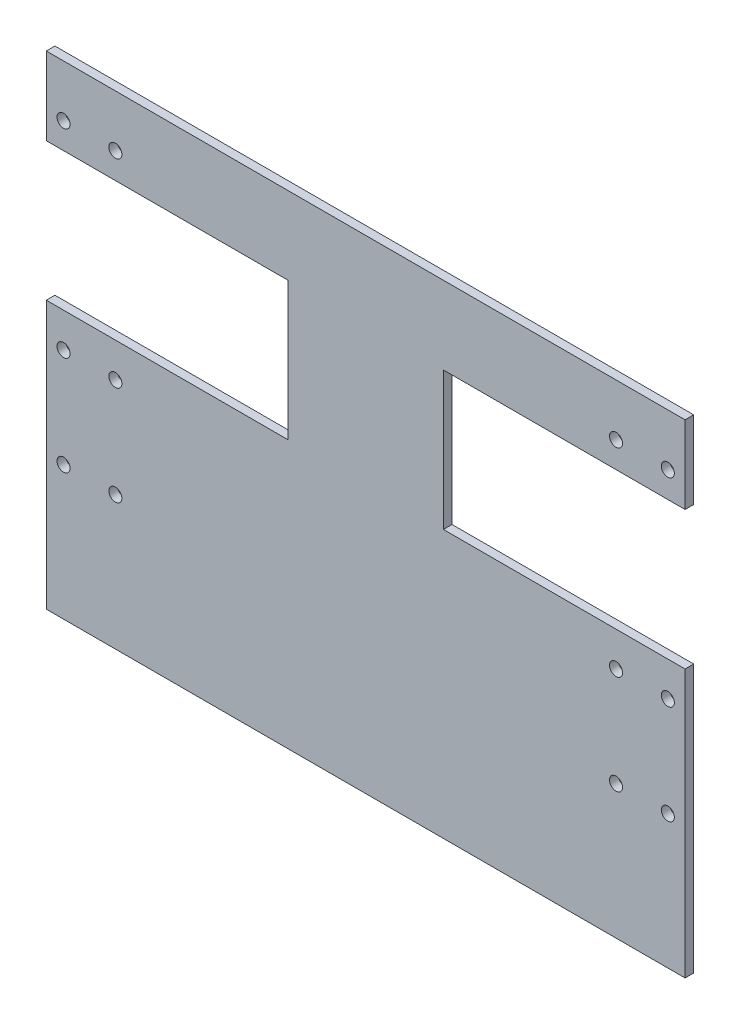
ISO-10303-21;
HEADER;
FILE_DESCRIPTION(('STEP AP214'),'2;1');
FILE_NAME('part.step','',(''),(''),'','','');
FILE_SCHEMA(('AUTOMOTIVE_DESIGN { 1 0 10303 214 1 1 1 1 }'));
ENDSEC;
DATA;
#1=APPLICATION_CONTEXT('core data for automotive mechanical design processes');
#2=APPLICATION_PROTOCOL_DEFINITION('international standard','automotive_design',2000,#1);
#3=PRODUCT_CONTEXT('',#1,'mechanical');
#4=PRODUCT('Part','Part','',(#3));
#5=PRODUCT_RELATED_PRODUCT_CATEGORY('part','',(#4));
#6=PRODUCT_DEFINITION_FORMATION('','',#4);
#7=PRODUCT_DEFINITION_CONTEXT('part definition',#1,'design');
#8=PRODUCT_DEFINITION('design','',#6,#7);
#9=PRODUCT_DEFINITION_SHAPE('','',#8);
#10=(LENGTH_UNIT() NAMED_UNIT(*) SI_UNIT(.MILLI.,.METRE.));
#11=(NAMED_UNIT(*) PLANE_ANGLE_UNIT() SI_UNIT($,.RADIAN.));
#12=(NAMED_UNIT(*) SI_UNIT($,.STERADIAN.) SOLID_ANGLE_UNIT());
#13=UNCERTAINTY_MEASURE_WITH_UNIT(LENGTH_MEASURE(1.E-05),#10,'distance_accuracy_value','');
#14=(GEOMETRIC_REPRESENTATION_CONTEXT(3) GLOBAL_UNCERTAINTY_ASSIGNED_CONTEXT((#13)) GLOBAL_UNIT_ASSIGNED_CONTEXT((#10,
#11,#12)) REPRESENTATION_CONTEXT('',''));
#15=CARTESIAN_POINT('',(0.,0.,0.));
#16=DIRECTION('',(0.,0.,1.));
#17=DIRECTION('',(1.,0.,0.));
#18=AXIS2_PLACEMENT_3D('',#15,#16,#17);
#19=CARTESIAN_POINT('',(0.,0.,0.));
#20=DIRECTION('',(0.,0.,-1.));
#21=DIRECTION('',(-1.,0.,0.));
#22=AXIS2_PLACEMENT_3D('',#19,#20,#21);
#23=PLANE('',#22);
#24=CARTESIAN_POINT('',(25.4,158.75,0.));
#25=DIRECTION('',(0.,0.,-1.));
#26=DIRECTION('',(-1.,0.,0.));
#27=AXIS2_PLACEMENT_3D('',#24,#25,#26);
#28=CIRCLE('',#27,2.4003);
#29=CARTESIAN_POINT('',(22.9997,158.75,0.));
#30=VERTEX_POINT('',#29);
#31=EDGE_CURVE('E161',#30,#30,#28,.F.);
#32=ORIENTED_EDGE('',*,*,#31,.T.);
#33=EDGE_LOOP('',(#32));
#34=FACE_BOUND('',#33,.T.);
#35=CARTESIAN_POINT('',(25.4,85.725,0.));
#36=DIRECTION('',(0.,0.,-1.));
#37=DIRECTION('',(-1.,0.,0.));
#38=AXIS2_PLACEMENT_3D('',#35,#36,#37);
#39=CIRCLE('',#38,2.40029999999999);
#40=CARTESIAN_POINT('',(22.9997,85.725,0.));
#41=VERTEX_POINT('',#40);
#42=EDGE_CURVE('E167',#41,#41,#39,.F.);
#43=ORIENTED_EDGE('',*,*,#42,.T.);
#44=EDGE_LOOP('',(#43));
#45=FACE_BOUND('',#44,.T.);
#46=CARTESIAN_POINT('',(25.4,49.2124999999995,0.));
#47=DIRECTION('',(0.,0.,-1.));
#48=DIRECTION('',(-1.,0.,0.));
#49=AXIS2_PLACEMENT_3D('',#46,#47,#48);
#50=CIRCLE('',#49,2.40029999999999);
#51=CARTESIAN_POINT('',(22.9997,49.2124999999995,0.));
#52=VERTEX_POINT('',#51);
#53=EDGE_CURVE('E173',#52,#52,#50,.F.);
#54=ORIENTED_EDGE('',*,*,#53,.T.);
#55=EDGE_LOOP('',(#54));
#56=FACE_BOUND('',#55,.T.);
#57=CARTESIAN_POINT('',(228.6,49.2124999999995,0.));
#58=DIRECTION('',(0.,0.,-1.));
#59=DIRECTION('',(-1.,0.,0.));
#60=AXIS2_PLACEMENT_3D('',#57,#58,#59);
#61=CIRCLE('',#60,2.40029999999999);
#62=CARTESIAN_POINT('',(226.1997,49.2124999999995,0.));
#63=VERTEX_POINT('',#62);
#64=EDGE_CURVE('E179',#63,#63,#61,.F.);
#65=ORIENTED_EDGE('',*,*,#64,.T.);
#66=EDGE_LOOP('',(#65));
#67=FACE_BOUND('',#66,.T.);
#68=CARTESIAN_POINT('',(228.6,85.725,0.));
#69=DIRECTION('',(0.,0.,-1.));
#70=DIRECTION('',(-1.,0.,0.));
#71=AXIS2_PLACEMENT_3D('',#68,#69,#70);
#72=CIRCLE('',#71,2.40029999999999);
#73=CARTESIAN_POINT('',(226.1997,85.725,0.));
#74=VERTEX_POINT('',#73);
#75=EDGE_CURVE('E185',#74,#74,#72,.F.);
#76=ORIENTED_EDGE('',*,*,#75,.T.);
#77=EDGE_LOOP('',(#76));
#78=FACE_BOUND('',#77,.T.);
#79=CARTESIAN_POINT('',(228.6,158.75,0.));
#80=DIRECTION('',(0.,0.,-1.));
#81=DIRECTION('',(-1.,0.,0.));
#82=AXIS2_PLACEMENT_3D('',#79,#80,#81);
#83=CIRCLE('',#82,2.40029999999999);
#84=CARTESIAN_POINT('',(226.1997,158.75,0.));
#85=VERTEX_POINT('',#84);
#86=EDGE_CURVE('E190',#85,#85,#83,.F.);
#87=ORIENTED_EDGE('',*,*,#86,.T.);
#88=EDGE_LOOP('',(#87));
#89=FACE_BOUND('',#88,.T.);
#90=DIRECTION('',(0.,1.,0.));
#91=VECTOR('',#90,1.);
#92=CARTESIAN_POINT('',(0.,149.225,0.));
#93=LINE('',#92,#91);
#94=CARTESIAN_POINT('',(0.,149.225,0.));
#95=VERTEX_POINT('',#94);
#96=CARTESIAN_POINT('',(0.,177.8,0.));
#97=VERTEX_POINT('',#96);
#98=EDGE_CURVE('E208',#95,#97,#93,.T.);
#99=ORIENTED_EDGE('',*,*,#98,.T.);
#100=DIRECTION('',(1.,0.,0.));
#101=VECTOR('',#100,1.);
#102=CARTESIAN_POINT('',(0.,177.8,0.));
#103=LINE('',#102,#101);
#104=CARTESIAN_POINT('',(234.95,177.8,0.));
#105=VERTEX_POINT('',#104);
#106=EDGE_CURVE('E203',#97,#105,#103,.T.);
#107=ORIENTED_EDGE('',*,*,#106,.T.);
#108=DIRECTION('',(0.,-1.,0.));
#109=VECTOR('',#108,1.);
#110=CARTESIAN_POINT('',(234.95,149.225,0.));
#111=LINE('',#110,#109);
#112=CARTESIAN_POINT('',(234.95,149.225,0.));
#113=VERTEX_POINT('',#112);
#114=EDGE_CURVE('E108',#105,#113,#111,.T.);
#115=ORIENTED_EDGE('',*,*,#114,.T.);
#116=DIRECTION('',(1.,0.,0.));
#117=VECTOR('',#116,1.);
#118=CARTESIAN_POINT('',(234.95,149.225,0.));
#119=LINE('',#118,#117);
#120=CARTESIAN_POINT('',(146.05,149.225,0.));
#121=VERTEX_POINT('',#120);
#122=EDGE_CURVE('E106',#113,#121,#119,.F.);
#123=ORIENTED_EDGE('',*,*,#122,.T.);
#124=DIRECTION('',(0.,-1.,0.));
#125=VECTOR('',#124,1.);
#126=CARTESIAN_POINT('',(146.05,149.225,0.));
#127=LINE('',#126,#125);
#128=CARTESIAN_POINT('',(146.05,98.425,0.));
#129=VERTEX_POINT('',#128);
#130=EDGE_CURVE('E103',#121,#129,#127,.T.);
#131=ORIENTED_EDGE('',*,*,#130,.T.);
#132=DIRECTION('',(1.,0.,0.));
#133=VECTOR('',#132,1.);
#134=CARTESIAN_POINT('',(146.05,98.425,0.));
#135=LINE('',#134,#133);
#136=CARTESIAN_POINT('',(234.95,98.425,0.));
#137=VERTEX_POINT('',#136);
#138=EDGE_CURVE('E243',#129,#137,#135,.T.);
#139=ORIENTED_EDGE('',*,*,#138,.T.);
#140=DIRECTION('',(0.,-1.,0.));
#141=VECTOR('',#140,1.);
#142=CARTESIAN_POINT('',(234.95,0.,0.));
#143=LINE('',#142,#141);
#144=CARTESIAN_POINT('',(234.95,0.,0.));
#145=VERTEX_POINT('',#144);
#146=EDGE_CURVE('E238',#137,#145,#143,.T.);
#147=ORIENTED_EDGE('',*,*,#146,.T.);
#148=DIRECTION('',(1.,0.,0.));
#149=VECTOR('',#148,1.);
#150=CARTESIAN_POINT('',(0.,0.,0.));
#151=LINE('',#150,#149);
#152=CARTESIAN_POINT('',(0.,0.,0.));
#153=VERTEX_POINT('',#152);
#154=EDGE_CURVE('E233',#145,#153,#151,.F.);
#155=ORIENTED_EDGE('',*,*,#154,.T.);
#156=DIRECTION('',(0.,1.,0.));
#157=VECTOR('',#156,1.);
#158=CARTESIAN_POINT('',(0.,0.,0.));
#159=LINE('',#158,#157);
#160=CARTESIAN_POINT('',(0.,98.425,0.));
#161=VERTEX_POINT('',#160);
#162=EDGE_CURVE('E228',#153,#161,#159,.T.);
#163=ORIENTED_EDGE('',*,*,#162,.T.);
#164=DIRECTION('',(1.,0.,0.));
#165=VECTOR('',#164,1.);
#166=CARTESIAN_POINT('',(0.,98.425,0.));
#167=LINE('',#166,#165);
#168=CARTESIAN_POINT('',(88.9,98.425,0.));
#169=VERTEX_POINT('',#168);
#170=EDGE_CURVE('E223',#161,#169,#167,.T.);
#171=ORIENTED_EDGE('',*,*,#170,.T.);
#172=DIRECTION('',(0.,1.,0.));
#173=VECTOR('',#172,1.);
#174=CARTESIAN_POINT('',(88.9,149.225,0.));
#175=LINE('',#174,#173);
#176=CARTESIAN_POINT('',(88.9,149.225,0.));
#177=VERTEX_POINT('',#176);
#178=EDGE_CURVE('E218',#169,#177,#175,.T.);
#179=ORIENTED_EDGE('',*,*,#178,.T.);
#180=DIRECTION('',(-1.,0.,0.));
#181=VECTOR('',#180,1.);
#182=CARTESIAN_POINT('',(0.,149.225,0.));
#183=LINE('',#182,#181);
#184=EDGE_CURVE('E213',#177,#95,#183,.T.);
#185=ORIENTED_EDGE('',*,*,#184,.T.);
#186=EDGE_LOOP('',(#99,#107,#115,#123,#131,#139,#147,#155,#163,#171,#179,#185));
#187=FACE_BOUND('',#186,.T.);
#188=CARTESIAN_POINT('',(209.55,158.75,0.));
#189=DIRECTION('',(0.,0.,-1.));
#190=DIRECTION('',(-1.,0.,0.));
#191=AXIS2_PLACEMENT_3D('',#188,#189,#190);
#192=CIRCLE('',#191,2.40029999999999);
#193=CARTESIAN_POINT('',(207.1497,158.75,0.));
#194=VERTEX_POINT('',#193);
#195=EDGE_CURVE('E19',#194,#194,#192,.F.);
#196=ORIENTED_EDGE('',*,*,#195,.T.);
#197=EDGE_LOOP('',(#196));
#198=FACE_BOUND('',#197,.T.);
#199=CARTESIAN_POINT('',(209.55,85.725,0.));
#200=DIRECTION('',(0.,0.,-1.));
#201=DIRECTION('',(-1.,0.,0.));
#202=AXIS2_PLACEMENT_3D('',#199,#200,#201);
#203=CIRCLE('',#202,2.40029999999999);
#204=CARTESIAN_POINT('',(207.1497,85.725,0.));
#205=VERTEX_POINT('',#204);
#206=EDGE_CURVE('E188',#205,#205,#203,.F.);
#207=ORIENTED_EDGE('',*,*,#206,.T.);
#208=EDGE_LOOP('',(#207));
#209=FACE_BOUND('',#208,.T.);
#210=CARTESIAN_POINT('',(209.55,49.2124999999995,0.));
#211=DIRECTION('',(0.,0.,-1.));
#212=DIRECTION('',(-1.,0.,0.));
#213=AXIS2_PLACEMENT_3D('',#210,#211,#212);
#214=CIRCLE('',#213,2.40029999999999);
#215=CARTESIAN_POINT('',(207.1497,49.2124999999995,0.));
#216=VERTEX_POINT('',#215);
#217=EDGE_CURVE('E182',#216,#216,#214,.F.);
#218=ORIENTED_EDGE('',*,*,#217,.T.);
#219=EDGE_LOOP('',(#218));
#220=FACE_BOUND('',#219,.T.);
#221=CARTESIAN_POINT('',(6.34999999999997,49.2124999999995,0.));
#222=DIRECTION('',(0.,0.,-1.));
#223=DIRECTION('',(-1.,0.,0.));
#224=AXIS2_PLACEMENT_3D('',#221,#222,#223);
#225=CIRCLE('',#224,2.40029999999999);
#226=CARTESIAN_POINT('',(3.94969999999997,49.2124999999995,0.));
#227=VERTEX_POINT('',#226);
#228=EDGE_CURVE('E176',#227,#227,#225,.F.);
#229=ORIENTED_EDGE('',*,*,#228,.T.);
#230=EDGE_LOOP('',(#229));
#231=FACE_BOUND('',#230,.T.);
#232=CARTESIAN_POINT('',(6.34999999999997,85.725,0.));
#233=DIRECTION('',(0.,0.,-1.));
#234=DIRECTION('',(-1.,0.,0.));
#235=AXIS2_PLACEMENT_3D('',#232,#233,#234);
#236=CIRCLE('',#235,2.40029999999999);
#237=CARTESIAN_POINT('',(3.94969999999997,85.725,0.));
#238=VERTEX_POINT('',#237);
#239=EDGE_CURVE('E170',#238,#238,#236,.F.);
#240=ORIENTED_EDGE('',*,*,#239,.T.);
#241=EDGE_LOOP('',(#240));
#242=FACE_BOUND('',#241,.T.);
#243=CARTESIAN_POINT('',(6.34999999999997,158.75,0.));
#244=DIRECTION('',(0.,0.,-1.));
#245=DIRECTION('',(-1.,0.,0.));
#246=AXIS2_PLACEMENT_3D('',#243,#244,#245);
#247=CIRCLE('',#246,2.4003);
#248=CARTESIAN_POINT('',(3.94969999999997,158.75,0.));
#249=VERTEX_POINT('',#248);
#250=EDGE_CURVE('E164',#249,#249,#247,.F.);
#251=ORIENTED_EDGE('',*,*,#250,.T.);
#252=EDGE_LOOP('',(#251));
#253=FACE_BOUND('',#252,.T.);
#254=ADVANCED_FACE('F16',(#34,#45,#56,#67,#78,#89,#187,#198,#209,#220,#231,#242,#253),#23,.T.);
#255=CARTESIAN_POINT('',(234.95,149.225,3.175));
#256=DIRECTION('',(0.,1.,0.));
#257=DIRECTION('',(0.,0.,1.));
#258=AXIS2_PLACEMENT_3D('',#255,#256,#257);
#259=PLANE('',#258);
#260=DIRECTION('',(0.,0.,1.));
#261=VECTOR('',#260,1.);
#262=CARTESIAN_POINT('',(234.95,149.225,3.175));
#263=LINE('',#262,#261);
#264=CARTESIAN_POINT('',(234.95,149.225,3.175));
#265=VERTEX_POINT('',#264);
#266=EDGE_CURVE('E197',#113,#265,#263,.T.);
#267=ORIENTED_EDGE('',*,*,#266,.T.);
#268=DIRECTION('',(-1.,0.,0.));
#269=VECTOR('',#268,1.);
#270=CARTESIAN_POINT('',(0.,149.225,3.175));
#271=LINE('',#270,#269);
#272=CARTESIAN_POINT('',(146.05,149.225,3.175));
#273=VERTEX_POINT('',#272);
#274=EDGE_CURVE('E124',#265,#273,#271,.T.);
#275=ORIENTED_EDGE('',*,*,#274,.T.);
#276=DIRECTION('',(0.,0.,1.));
#277=VECTOR('',#276,1.);
#278=CARTESIAN_POINT('',(146.05,149.225,3.175));
#279=LINE('',#278,#277);
#280=EDGE_CURVE('E113',#273,#121,#279,.F.);
#281=ORIENTED_EDGE('',*,*,#280,.T.);
#282=ORIENTED_EDGE('',*,*,#122,.F.);
#283=EDGE_LOOP('',(#267,#275,#281,#282));
#284=FACE_BOUND('',#283,.T.);
#285=ADVANCED_FACE('F123',(#284),#259,.F.);
#286=CARTESIAN_POINT('',(146.05,149.225,3.175));
#287=DIRECTION('',(-1.,0.,0.));
#288=DIRECTION('',(0.,-1.,0.));
#289=AXIS2_PLACEMENT_3D('',#286,#287,#288);
#290=PLANE('',#289);
#291=ORIENTED_EDGE('',*,*,#280,.F.);
#292=DIRECTION('',(0.,1.,0.));
#293=VECTOR('',#292,1.);
#294=CARTESIAN_POINT('',(146.05,0.,3.175));
#295=LINE('',#294,#293);
#296=CARTESIAN_POINT('',(146.05,98.425,3.175));
#297=VERTEX_POINT('',#296);
#298=EDGE_CURVE('E257',#273,#297,#295,.F.);
#299=ORIENTED_EDGE('',*,*,#298,.T.);
#300=DIRECTION('',(0.,0.,1.));
#301=VECTOR('',#300,1.);
#302=CARTESIAN_POINT('',(146.05,98.425,3.175));
#303=LINE('',#302,#301);
#304=EDGE_CURVE('E120',#297,#129,#303,.F.);
#305=ORIENTED_EDGE('',*,*,#304,.T.);
#306=ORIENTED_EDGE('',*,*,#130,.F.);
#307=EDGE_LOOP('',(#291,#299,#305,#306));
#308=FACE_BOUND('',#307,.T.);
#309=ADVANCED_FACE('F117',(#308),#290,.F.);
#310=CARTESIAN_POINT('',(146.05,98.425,3.175));
#311=DIRECTION('',(0.,-1.,0.));
#312=DIRECTION('',(1.,0.,0.));
#313=AXIS2_PLACEMENT_3D('',#310,#311,#312);
#314=PLANE('',#313);
#315=ORIENTED_EDGE('',*,*,#304,.F.);
#316=DIRECTION('',(-1.,0.,0.));
#317=VECTOR('',#316,1.);
#318=CARTESIAN_POINT('',(0.,98.425,3.175));
#319=LINE('',#318,#317);
#320=CARTESIAN_POINT('',(234.95,98.425,3.175));
#321=VERTEX_POINT('',#320);
#322=EDGE_CURVE('E254',#297,#321,#319,.F.);
#323=ORIENTED_EDGE('',*,*,#322,.T.);
#324=DIRECTION('',(0.,0.,1.));
#325=VECTOR('',#324,1.);
#326=CARTESIAN_POINT('',(234.95,98.425,3.175));
#327=LINE('',#326,#325);
#328=EDGE_CURVE('E240',#321,#137,#327,.F.);
#329=ORIENTED_EDGE('',*,*,#328,.T.);
#330=ORIENTED_EDGE('',*,*,#138,.F.);
#331=EDGE_LOOP('',(#315,#323,#329,#330));
#332=FACE_BOUND('',#331,.T.);
#333=ADVANCED_FACE('F252',(#332),#314,.F.);
#334=CARTESIAN_POINT('',(234.95,0.,3.175));
#335=DIRECTION('',(-1.,0.,0.));
#336=DIRECTION('',(0.,-1.,0.));
#337=AXIS2_PLACEMENT_3D('',#334,#335,#336);
#338=PLANE('',#337);
#339=ORIENTED_EDGE('',*,*,#328,.F.);
#340=DIRECTION('',(0.,1.,0.));
#341=VECTOR('',#340,1.);
#342=CARTESIAN_POINT('',(234.95,0.,3.175));
#343=LINE('',#342,#341);
#344=CARTESIAN_POINT('',(234.95,0.,3.175));
#345=VERTEX_POINT('',#344);
#346=EDGE_CURVE('E256',#321,#345,#343,.F.);
#347=ORIENTED_EDGE('',*,*,#346,.T.);
#348=DIRECTION('',(0.,0.,1.));
#349=VECTOR('',#348,1.);
#350=CARTESIAN_POINT('',(234.95,0.,3.175));
#351=LINE('',#350,#349);
#352=EDGE_CURVE('E235',#345,#145,#351,.F.);
#353=ORIENTED_EDGE('',*,*,#352,.T.);
#354=ORIENTED_EDGE('',*,*,#146,.F.);
#355=EDGE_LOOP('',(#339,#347,#353,#354));
#356=FACE_BOUND('',#355,.T.);
#357=ADVANCED_FACE('F248',(#356),#338,.F.);
#358=CARTESIAN_POINT('',(0.,0.,3.175));
#359=DIRECTION('',(0.,1.,0.));
#360=DIRECTION('',(0.,0.,1.));
#361=AXIS2_PLACEMENT_3D('',#358,#359,#360);
#362=PLANE('',#361);
#363=ORIENTED_EDGE('',*,*,#352,.F.);
#364=DIRECTION('',(-1.,0.,0.));
#365=VECTOR('',#364,1.);
#366=CARTESIAN_POINT('',(0.,0.,3.175));
#367=LINE('',#366,#365);
#368=CARTESIAN_POINT('',(0.,0.,3.175));
#369=VERTEX_POINT('',#368);
#370=EDGE_CURVE('E259',#345,#369,#367,.T.);
#371=ORIENTED_EDGE('',*,*,#370,.T.);
#372=DIRECTION('',(0.,0.,1.));
#373=VECTOR('',#372,1.);
#374=CARTESIAN_POINT('',(0.,0.,3.175));
#375=LINE('',#374,#373);
#376=EDGE_CURVE('E230',#369,#153,#375,.F.);
#377=ORIENTED_EDGE('',*,*,#376,.T.);
#378=ORIENTED_EDGE('',*,*,#154,.F.);
#379=EDGE_LOOP('',(#363,#371,#377,#378));
#380=FACE_BOUND('',#379,.T.);
#381=ADVANCED_FACE('F310',(#380),#362,.F.);
#382=CARTESIAN_POINT('',(0.,0.,3.175));
#383=DIRECTION('',(1.,0.,0.));
#384=DIRECTION('',(0.,1.,0.));
#385=AXIS2_PLACEMENT_3D('',#382,#383,#384);
#386=PLANE('',#385);
#387=ORIENTED_EDGE('',*,*,#376,.F.);
#388=DIRECTION('',(0.,1.,0.));
#389=VECTOR('',#388,1.);
#390=CARTESIAN_POINT('',(0.,0.,3.175));
#391=LINE('',#390,#389);
#392=CARTESIAN_POINT('',(0.,98.425,3.175));
#393=VERTEX_POINT('',#392);
#394=EDGE_CURVE('E264',#369,#393,#391,.T.);
#395=ORIENTED_EDGE('',*,*,#394,.T.);
#396=DIRECTION('',(0.,0.,1.));
#397=VECTOR('',#396,1.);
#398=CARTESIAN_POINT('',(0.,98.425,3.175));
#399=LINE('',#398,#397);
#400=EDGE_CURVE('E225',#393,#161,#399,.F.);
#401=ORIENTED_EDGE('',*,*,#400,.T.);
#402=ORIENTED_EDGE('',*,*,#162,.F.);
#403=EDGE_LOOP('',(#387,#395,#401,#402));
#404=FACE_BOUND('',#403,.T.);
#405=ADVANCED_FACE('F307',(#404),#386,.F.);
#406=CARTESIAN_POINT('',(0.,98.425,3.175));
#407=DIRECTION('',(0.,-1.,0.));
#408=DIRECTION('',(1.,0.,0.));
#409=AXIS2_PLACEMENT_3D('',#406,#407,#408);
#410=PLANE('',#409);
#411=ORIENTED_EDGE('',*,*,#400,.F.);
#412=DIRECTION('',(-1.,0.,0.));
#413=VECTOR('',#412,1.);
#414=CARTESIAN_POINT('',(0.,98.425,3.175));
#415=LINE('',#414,#413);
#416=CARTESIAN_POINT('',(88.9,98.425,3.175));
#417=VERTEX_POINT('',#416);
#418=EDGE_CURVE('E267',#393,#417,#415,.F.);
#419=ORIENTED_EDGE('',*,*,#418,.T.);
#420=DIRECTION('',(0.,0.,-1.));
#421=VECTOR('',#420,1.);
#422=CARTESIAN_POINT('',(88.9,98.425,3.175));
#423=LINE('',#422,#421);
#424=EDGE_CURVE('E220',#417,#169,#423,.T.);
#425=ORIENTED_EDGE('',*,*,#424,.T.);
#426=ORIENTED_EDGE('',*,*,#170,.F.);
#427=EDGE_LOOP('',(#411,#419,#425,#426));
#428=FACE_BOUND('',#427,.T.);
#429=ADVANCED_FACE('F303',(#428),#410,.F.);
#430=CARTESIAN_POINT('',(88.9,149.225,3.175));
#431=DIRECTION('',(1.,0.,0.));
#432=DIRECTION('',(0.,0.,-1.));
#433=AXIS2_PLACEMENT_3D('',#430,#431,#432);
#434=PLANE('',#433);
#435=ORIENTED_EDGE('',*,*,#424,.F.);
#436=DIRECTION('',(0.,1.,0.));
#437=VECTOR('',#436,1.);
#438=CARTESIAN_POINT('',(88.9,0.,3.175));
#439=LINE('',#438,#437);
#440=CARTESIAN_POINT('',(88.9,149.225,3.175));
#441=VERTEX_POINT('',#440);
#442=EDGE_CURVE('E270',#417,#441,#439,.T.);
#443=ORIENTED_EDGE('',*,*,#442,.T.);
#444=DIRECTION('',(0.,0.,1.));
#445=VECTOR('',#444,1.);
#446=CARTESIAN_POINT('',(88.9,149.225,3.175));
#447=LINE('',#446,#445);
#448=EDGE_CURVE('E215',#441,#177,#447,.F.);
#449=ORIENTED_EDGE('',*,*,#448,.T.);
#450=ORIENTED_EDGE('',*,*,#178,.F.);
#451=EDGE_LOOP('',(#435,#443,#449,#450));
#452=FACE_BOUND('',#451,.T.);
#453=ADVANCED_FACE('F299',(#452),#434,.F.);
#454=CARTESIAN_POINT('',(0.,149.225,3.175));
#455=DIRECTION('',(0.,1.,0.));
#456=DIRECTION('',(-1.,0.,0.));
#457=AXIS2_PLACEMENT_3D('',#454,#455,#456);
#458=PLANE('',#457);
#459=ORIENTED_EDGE('',*,*,#448,.F.);
#460=DIRECTION('',(-1.,0.,0.));
#461=VECTOR('',#460,1.);
#462=CARTESIAN_POINT('',(0.,149.225,3.175));
#463=LINE('',#462,#461);
#464=CARTESIAN_POINT('',(0.,149.225,3.175));
#465=VERTEX_POINT('',#464);
#466=EDGE_CURVE('E273',#441,#465,#463,.T.);
#467=ORIENTED_EDGE('',*,*,#466,.T.);
#468=DIRECTION('',(0.,0.,1.));
#469=VECTOR('',#468,1.);
#470=CARTESIAN_POINT('',(0.,149.225,3.175));
#471=LINE('',#470,#469);
#472=EDGE_CURVE('E210',#465,#95,#471,.F.);
#473=ORIENTED_EDGE('',*,*,#472,.T.);
#474=ORIENTED_EDGE('',*,*,#184,.F.);
#475=EDGE_LOOP('',(#459,#467,#473,#474));
#476=FACE_BOUND('',#475,.T.);
#477=ADVANCED_FACE('F295',(#476),#458,.F.);
#478=CARTESIAN_POINT('',(0.,149.225,3.175));
#479=DIRECTION('',(1.,0.,0.));
#480=DIRECTION('',(0.,1.,0.));
#481=AXIS2_PLACEMENT_3D('',#478,#479,#480);
#482=PLANE('',#481);
#483=ORIENTED_EDGE('',*,*,#472,.F.);
#484=DIRECTION('',(0.,1.,0.));
#485=VECTOR('',#484,1.);
#486=CARTESIAN_POINT('',(0.,0.,3.175));
#487=LINE('',#486,#485);
#488=CARTESIAN_POINT('',(0.,177.8,3.175));
#489=VERTEX_POINT('',#488);
#490=EDGE_CURVE('E276',#465,#489,#487,.T.);
#491=ORIENTED_EDGE('',*,*,#490,.T.);
#492=DIRECTION('',(0.,0.,-1.));
#493=VECTOR('',#492,1.);
#494=CARTESIAN_POINT('',(0.,177.8,3.175));
#495=LINE('',#494,#493);
#496=EDGE_CURVE('E205',#489,#97,#495,.T.);
#497=ORIENTED_EDGE('',*,*,#496,.T.);
#498=ORIENTED_EDGE('',*,*,#98,.F.);
#499=EDGE_LOOP('',(#483,#491,#497,#498));
#500=FACE_BOUND('',#499,.T.);
#501=ADVANCED_FACE('F291',(#500),#482,.F.);
#502=CARTESIAN_POINT('',(0.,177.8,3.175));
#503=DIRECTION('',(0.,-1.,0.));
#504=DIRECTION('',(0.,0.,-1.));
#505=AXIS2_PLACEMENT_3D('',#502,#503,#504);
#506=PLANE('',#505);
#507=ORIENTED_EDGE('',*,*,#496,.F.);
#508=DIRECTION('',(-1.,0.,0.));
#509=VECTOR('',#508,1.);
#510=CARTESIAN_POINT('',(0.,177.8,3.175));
#511=LINE('',#510,#509);
#512=CARTESIAN_POINT('',(234.95,177.8,3.175));
#513=VERTEX_POINT('',#512);
#514=EDGE_CURVE('E279',#489,#513,#511,.F.);
#515=ORIENTED_EDGE('',*,*,#514,.T.);
#516=DIRECTION('',(0.,0.,1.));
#517=VECTOR('',#516,1.);
#518=CARTESIAN_POINT('',(234.95,177.8,3.175));
#519=LINE('',#518,#517);
#520=EDGE_CURVE('E34',#513,#105,#519,.F.);
#521=ORIENTED_EDGE('',*,*,#520,.T.);
#522=ORIENTED_EDGE('',*,*,#106,.F.);
#523=EDGE_LOOP('',(#507,#515,#521,#522));
#524=FACE_BOUND('',#523,.T.);
#525=ADVANCED_FACE('F287',(#524),#506,.F.);
#526=CARTESIAN_POINT('',(234.95,149.225,3.175));
#527=DIRECTION('',(-1.,0.,0.));
#528=DIRECTION('',(0.,-1.,0.));
#529=AXIS2_PLACEMENT_3D('',#526,#527,#528);
#530=PLANE('',#529);
#531=ORIENTED_EDGE('',*,*,#520,.F.);
#532=DIRECTION('',(0.,1.,0.));
#533=VECTOR('',#532,1.);
#534=CARTESIAN_POINT('',(234.95,0.,3.175));
#535=LINE('',#534,#533);
#536=EDGE_CURVE('E160',#513,#265,#535,.F.);
#537=ORIENTED_EDGE('',*,*,#536,.T.);
#538=ORIENTED_EDGE('',*,*,#266,.F.);
#539=ORIENTED_EDGE('',*,*,#114,.F.);
#540=EDGE_LOOP('',(#531,#537,#538,#539));
#541=FACE_BOUND('',#540,.T.);
#542=ADVANCED_FACE('F282',(#541),#530,.F.);
#543=CARTESIAN_POINT('',(209.55,158.75,3.175));
#544=DIRECTION('',(0.,0.,-1.));
#545=DIRECTION('',(-1.,0.,0.));
#546=AXIS2_PLACEMENT_3D('',#543,#544,#545);
#547=CYLINDRICAL_SURFACE('',#546,2.40029999999999);
#548=ORIENTED_EDGE('',*,*,#195,.F.);
#549=EDGE_LOOP('',(#548));
#550=FACE_BOUND('',#549,.T.);
#551=CARTESIAN_POINT('',(209.55,158.75,3.175));
#552=DIRECTION('',(0.,0.,-1.));
#553=DIRECTION('',(-1.,0.,0.));
#554=AXIS2_PLACEMENT_3D('',#551,#552,#553);
#555=CIRCLE('',#554,2.40029999999999);
#556=CARTESIAN_POINT('',(207.1497,158.75,3.175));
#557=VERTEX_POINT('',#556);
#558=EDGE_CURVE('E157',#557,#557,#555,.F.);
#559=ORIENTED_EDGE('',*,*,#558,.T.);
#560=EDGE_LOOP('',(#559));
#561=FACE_BOUND('',#560,.T.);
#562=ADVANCED_FACE('F371',(#550,#561),#547,.F.);
#563=CARTESIAN_POINT('',(228.6,158.75,3.175));
#564=DIRECTION('',(0.,0.,-1.));
#565=DIRECTION('',(-1.,0.,0.));
#566=AXIS2_PLACEMENT_3D('',#563,#564,#565);
#567=CYLINDRICAL_SURFACE('',#566,2.40029999999999);
#568=ORIENTED_EDGE('',*,*,#86,.F.);
#569=EDGE_LOOP('',(#568));
#570=FACE_BOUND('',#569,.T.);
#571=CARTESIAN_POINT('',(228.6,158.75,3.175));
#572=DIRECTION('',(0.,0.,-1.));
#573=DIRECTION('',(-1.,0.,0.));
#574=AXIS2_PLACEMENT_3D('',#571,#572,#573);
#575=CIRCLE('',#574,2.40029999999999);
#576=CARTESIAN_POINT('',(226.1997,158.75,3.175));
#577=VERTEX_POINT('',#576);
#578=EDGE_CURVE('E154',#577,#577,#575,.F.);
#579=ORIENTED_EDGE('',*,*,#578,.T.);
#580=EDGE_LOOP('',(#579));
#581=FACE_BOUND('',#580,.T.);
#582=ADVANCED_FACE('F367',(#570,#581),#567,.F.);
#583=CARTESIAN_POINT('',(209.55,85.725,3.175));
#584=DIRECTION('',(0.,0.,-1.));
#585=DIRECTION('',(-1.,0.,0.));
#586=AXIS2_PLACEMENT_3D('',#583,#584,#585);
#587=CYLINDRICAL_SURFACE('',#586,2.40029999999999);
#588=ORIENTED_EDGE('',*,*,#206,.F.);
#589=EDGE_LOOP('',(#588));
#590=FACE_BOUND('',#589,.T.);
#591=CARTESIAN_POINT('',(209.55,85.725,3.175));
#592=DIRECTION('',(0.,0.,-1.));
#593=DIRECTION('',(-1.,0.,0.));
#594=AXIS2_PLACEMENT_3D('',#591,#592,#593);
#595=CIRCLE('',#594,2.40029999999999);
#596=CARTESIAN_POINT('',(207.1497,85.725,3.175));
#597=VERTEX_POINT('',#596);
#598=EDGE_CURVE('E151',#597,#597,#595,.F.);
#599=ORIENTED_EDGE('',*,*,#598,.T.);
#600=EDGE_LOOP('',(#599));
#601=FACE_BOUND('',#600,.T.);
#602=ADVANCED_FACE('F363',(#590,#601),#587,.F.);
#603=CARTESIAN_POINT('',(228.6,85.725,3.175));
#604=DIRECTION('',(0.,0.,-1.));
#605=DIRECTION('',(-1.,0.,0.));
#606=AXIS2_PLACEMENT_3D('',#603,#604,#605);
#607=CYLINDRICAL_SURFACE('',#606,2.40029999999999);
#608=ORIENTED_EDGE('',*,*,#75,.F.);
#609=EDGE_LOOP('',(#608));
#610=FACE_BOUND('',#609,.T.);
#611=CARTESIAN_POINT('',(228.6,85.725,3.175));
#612=DIRECTION('',(0.,0.,-1.));
#613=DIRECTION('',(-1.,0.,0.));
#614=AXIS2_PLACEMENT_3D('',#611,#612,#613);
#615=CIRCLE('',#614,2.40029999999999);
#616=CARTESIAN_POINT('',(226.1997,85.725,3.175));
#617=VERTEX_POINT('',#616);
#618=EDGE_CURVE('E148',#617,#617,#615,.F.);
#619=ORIENTED_EDGE('',*,*,#618,.T.);
#620=EDGE_LOOP('',(#619));
#621=FACE_BOUND('',#620,.T.);
#622=ADVANCED_FACE('F359',(#610,#621),#607,.F.);
#623=CARTESIAN_POINT('',(209.55,49.2124999999995,3.175));
#624=DIRECTION('',(0.,0.,-1.));
#625=DIRECTION('',(-1.,0.,0.));
#626=AXIS2_PLACEMENT_3D('',#623,#624,#625);
#627=CYLINDRICAL_SURFACE('',#626,2.40029999999999);
#628=ORIENTED_EDGE('',*,*,#217,.F.);
#629=EDGE_LOOP('',(#628));
#630=FACE_BOUND('',#629,.T.);
#631=CARTESIAN_POINT('',(209.55,49.2124999999995,3.175));
#632=DIRECTION('',(0.,0.,-1.));
#633=DIRECTION('',(-1.,0.,0.));
#634=AXIS2_PLACEMENT_3D('',#631,#632,#633);
#635=CIRCLE('',#634,2.40029999999999);
#636=CARTESIAN_POINT('',(207.1497,49.2124999999995,3.175));
#637=VERTEX_POINT('',#636);
#638=EDGE_CURVE('E145',#637,#637,#635,.F.);
#639=ORIENTED_EDGE('',*,*,#638,.T.);
#640=EDGE_LOOP('',(#639));
#641=FACE_BOUND('',#640,.T.);
#642=ADVANCED_FACE('F355',(#630,#641),#627,.F.);
#643=CARTESIAN_POINT('',(228.6,49.2124999999995,3.175));
#644=DIRECTION('',(0.,0.,-1.));
#645=DIRECTION('',(-1.,0.,0.));
#646=AXIS2_PLACEMENT_3D('',#643,#644,#645);
#647=CYLINDRICAL_SURFACE('',#646,2.40029999999999);
#648=ORIENTED_EDGE('',*,*,#64,.F.);
#649=EDGE_LOOP('',(#648));
#650=FACE_BOUND('',#649,.T.);
#651=CARTESIAN_POINT('',(228.6,49.2124999999995,3.175));
#652=DIRECTION('',(0.,0.,-1.));
#653=DIRECTION('',(-1.,0.,0.));
#654=AXIS2_PLACEMENT_3D('',#651,#652,#653);
#655=CIRCLE('',#654,2.40029999999999);
#656=CARTESIAN_POINT('',(226.1997,49.2124999999995,3.175));
#657=VERTEX_POINT('',#656);
#658=EDGE_CURVE('E142',#657,#657,#655,.F.);
#659=ORIENTED_EDGE('',*,*,#658,.T.);
#660=EDGE_LOOP('',(#659));
#661=FACE_BOUND('',#660,.T.);
#662=ADVANCED_FACE('F351',(#650,#661),#647,.F.);
#663=CARTESIAN_POINT('',(6.34999999999997,49.2124999999995,3.175));
#664=DIRECTION('',(0.,0.,-1.));
#665=DIRECTION('',(-1.,0.,0.));
#666=AXIS2_PLACEMENT_3D('',#663,#664,#665);
#667=CYLINDRICAL_SURFACE('',#666,2.40029999999999);
#668=ORIENTED_EDGE('',*,*,#228,.F.);
#669=EDGE_LOOP('',(#668));
#670=FACE_BOUND('',#669,.T.);
#671=CARTESIAN_POINT('',(6.34999999999997,49.2124999999995,3.175));
#672=DIRECTION('',(0.,0.,-1.));
#673=DIRECTION('',(-1.,0.,0.));
#674=AXIS2_PLACEMENT_3D('',#671,#672,#673);
#675=CIRCLE('',#674,2.40029999999999);
#676=CARTESIAN_POINT('',(3.94969999999997,49.2124999999995,3.175));
#677=VERTEX_POINT('',#676);
#678=EDGE_CURVE('E139',#677,#677,#675,.F.);
#679=ORIENTED_EDGE('',*,*,#678,.T.);
#680=EDGE_LOOP('',(#679));
#681=FACE_BOUND('',#680,.T.);
#682=ADVANCED_FACE('F347',(#670,#681),#667,.F.);
#683=CARTESIAN_POINT('',(25.4,49.2124999999995,3.175));
#684=DIRECTION('',(0.,0.,-1.));
#685=DIRECTION('',(-1.,0.,0.));
#686=AXIS2_PLACEMENT_3D('',#683,#684,#685);
#687=CYLINDRICAL_SURFACE('',#686,2.40029999999999);
#688=ORIENTED_EDGE('',*,*,#53,.F.);
#689=EDGE_LOOP('',(#688));
#690=FACE_BOUND('',#689,.T.);
#691=CARTESIAN_POINT('',(25.4,49.2124999999995,3.175));
#692=DIRECTION('',(0.,0.,-1.));
#693=DIRECTION('',(-1.,0.,0.));
#694=AXIS2_PLACEMENT_3D('',#691,#692,#693);
#695=CIRCLE('',#694,2.40029999999999);
#696=CARTESIAN_POINT('',(22.9997,49.2124999999995,3.175));
#697=VERTEX_POINT('',#696);
#698=EDGE_CURVE('E136',#697,#697,#695,.F.);
#699=ORIENTED_EDGE('',*,*,#698,.T.);
#700=EDGE_LOOP('',(#699));
#701=FACE_BOUND('',#700,.T.);
#702=ADVANCED_FACE('F343',(#690,#701),#687,.F.);
#703=CARTESIAN_POINT('',(6.34999999999997,85.725,3.175));
#704=DIRECTION('',(0.,0.,-1.));
#705=DIRECTION('',(-1.,0.,0.));
#706=AXIS2_PLACEMENT_3D('',#703,#704,#705);
#707=CYLINDRICAL_SURFACE('',#706,2.40029999999999);
#708=ORIENTED_EDGE('',*,*,#239,.F.);
#709=EDGE_LOOP('',(#708));
#710=FACE_BOUND('',#709,.T.);
#711=CARTESIAN_POINT('',(6.34999999999997,85.725,3.175));
#712=DIRECTION('',(0.,0.,-1.));
#713=DIRECTION('',(-1.,0.,0.));
#714=AXIS2_PLACEMENT_3D('',#711,#712,#713);
#715=CIRCLE('',#714,2.40029999999999);
#716=CARTESIAN_POINT('',(3.94969999999997,85.725,3.175));
#717=VERTEX_POINT('',#716);
#718=EDGE_CURVE('E133',#717,#717,#715,.F.);
#719=ORIENTED_EDGE('',*,*,#718,.T.);
#720=EDGE_LOOP('',(#719));
#721=FACE_BOUND('',#720,.T.);
#722=ADVANCED_FACE('F339',(#710,#721),#707,.F.);
#723=CARTESIAN_POINT('',(25.4,85.725,3.175));
#724=DIRECTION('',(0.,0.,-1.));
#725=DIRECTION('',(-1.,0.,0.));
#726=AXIS2_PLACEMENT_3D('',#723,#724,#725);
#727=CYLINDRICAL_SURFACE('',#726,2.40029999999999);
#728=ORIENTED_EDGE('',*,*,#42,.F.);
#729=EDGE_LOOP('',(#728));
#730=FACE_BOUND('',#729,.T.);
#731=CARTESIAN_POINT('',(25.4,85.725,3.175));
#732=DIRECTION('',(0.,0.,-1.));
#733=DIRECTION('',(-1.,0.,0.));
#734=AXIS2_PLACEMENT_3D('',#731,#732,#733);
#735=CIRCLE('',#734,2.40029999999999);
#736=CARTESIAN_POINT('',(22.9997,85.725,3.175));
#737=VERTEX_POINT('',#736);
#738=EDGE_CURVE('E130',#737,#737,#735,.F.);
#739=ORIENTED_EDGE('',*,*,#738,.T.);
#740=EDGE_LOOP('',(#739));
#741=FACE_BOUND('',#740,.T.);
#742=ADVANCED_FACE('F335',(#730,#741),#727,.F.);
#743=CARTESIAN_POINT('',(6.34999999999997,158.75,3.175));
#744=DIRECTION('',(0.,0.,-1.));
#745=DIRECTION('',(-1.,0.,0.));
#746=AXIS2_PLACEMENT_3D('',#743,#744,#745);
#747=CYLINDRICAL_SURFACE('',#746,2.4003);
#748=ORIENTED_EDGE('',*,*,#250,.F.);
#749=EDGE_LOOP('',(#748));
#750=FACE_BOUND('',#749,.T.);
#751=CARTESIAN_POINT('',(6.34999999999997,158.75,3.175));
#752=DIRECTION('',(0.,0.,-1.));
#753=DIRECTION('',(-1.,0.,0.));
#754=AXIS2_PLACEMENT_3D('',#751,#752,#753);
#755=CIRCLE('',#754,2.4003);
#756=CARTESIAN_POINT('',(3.94969999999997,158.75,3.175));
#757=VERTEX_POINT('',#756);
#758=EDGE_CURVE('E25',#757,#757,#755,.F.);
#759=ORIENTED_EDGE('',*,*,#758,.T.);
#760=EDGE_LOOP('',(#759));
#761=FACE_BOUND('',#760,.T.);
#762=ADVANCED_FACE('F327',(#750,#761),#747,.F.);
#763=CARTESIAN_POINT('',(25.4,158.75,3.175));
#764=DIRECTION('',(0.,0.,-1.));
#765=DIRECTION('',(-1.,0.,0.));
#766=AXIS2_PLACEMENT_3D('',#763,#764,#765);
#767=CYLINDRICAL_SURFACE('',#766,2.4003);
#768=ORIENTED_EDGE('',*,*,#31,.F.);
#769=EDGE_LOOP('',(#768));
#770=FACE_BOUND('',#769,.T.);
#771=CARTESIAN_POINT('',(25.4,158.75,3.175));
#772=DIRECTION('',(0.,0.,-1.));
#773=DIRECTION('',(-1.,0.,0.));
#774=AXIS2_PLACEMENT_3D('',#771,#772,#773);
#775=CIRCLE('',#774,2.4003);
#776=CARTESIAN_POINT('',(22.9997,158.75,3.175));
#777=VERTEX_POINT('',#776);
#778=EDGE_CURVE('E11',#777,#777,#775,.F.);
#779=ORIENTED_EDGE('',*,*,#778,.T.);
#780=EDGE_LOOP('',(#779));
#781=FACE_BOUND('',#780,.T.);
#782=ADVANCED_FACE('F321',(#770,#781),#767,.F.);
#783=CARTESIAN_POINT('',(0.,0.,3.175));
#784=DIRECTION('',(0.,0.,-1.));
#785=DIRECTION('',(-1.,0.,0.));
#786=AXIS2_PLACEMENT_3D('',#783,#784,#785);
#787=PLANE('',#786);
#788=ORIENTED_EDGE('',*,*,#778,.F.);
#789=EDGE_LOOP('',(#788));
#790=FACE_BOUND('',#789,.T.);
#791=ORIENTED_EDGE('',*,*,#758,.F.);
#792=EDGE_LOOP('',(#791));
#793=FACE_BOUND('',#792,.T.);
#794=ORIENTED_EDGE('',*,*,#738,.F.);
#795=EDGE_LOOP('',(#794));
#796=FACE_BOUND('',#795,.T.);
#797=ORIENTED_EDGE('',*,*,#718,.F.);
#798=EDGE_LOOP('',(#797));
#799=FACE_BOUND('',#798,.T.);
#800=ORIENTED_EDGE('',*,*,#698,.F.);
#801=EDGE_LOOP('',(#800));
#802=FACE_BOUND('',#801,.T.);
#803=ORIENTED_EDGE('',*,*,#678,.F.);
#804=EDGE_LOOP('',(#803));
#805=FACE_BOUND('',#804,.T.);
#806=ORIENTED_EDGE('',*,*,#658,.F.);
#807=EDGE_LOOP('',(#806));
#808=FACE_BOUND('',#807,.T.);
#809=ORIENTED_EDGE('',*,*,#638,.F.);
#810=EDGE_LOOP('',(#809));
#811=FACE_BOUND('',#810,.T.);
#812=ORIENTED_EDGE('',*,*,#618,.F.);
#813=EDGE_LOOP('',(#812));
#814=FACE_BOUND('',#813,.T.);
#815=ORIENTED_EDGE('',*,*,#598,.F.);
#816=EDGE_LOOP('',(#815));
#817=FACE_BOUND('',#816,.T.);
#818=ORIENTED_EDGE('',*,*,#578,.F.);
#819=EDGE_LOOP('',(#818));
#820=FACE_BOUND('',#819,.T.);
#821=ORIENTED_EDGE('',*,*,#558,.F.);
#822=EDGE_LOOP('',(#821));
#823=FACE_BOUND('',#822,.T.);
#824=ORIENTED_EDGE('',*,*,#514,.F.);
#825=ORIENTED_EDGE('',*,*,#490,.F.);
#826=ORIENTED_EDGE('',*,*,#466,.F.);
#827=ORIENTED_EDGE('',*,*,#442,.F.);
#828=ORIENTED_EDGE('',*,*,#418,.F.);
#829=ORIENTED_EDGE('',*,*,#394,.F.);
#830=ORIENTED_EDGE('',*,*,#370,.F.);
#831=ORIENTED_EDGE('',*,*,#346,.F.);
#832=ORIENTED_EDGE('',*,*,#322,.F.);
#833=ORIENTED_EDGE('',*,*,#298,.F.);
#834=ORIENTED_EDGE('',*,*,#274,.F.);
#835=ORIENTED_EDGE('',*,*,#536,.F.);
#836=EDGE_LOOP('',(#824,#825,#826,#827,#828,#829,#830,#831,#832,#833,#834,#835));
#837=FACE_BOUND('',#836,.T.);
#838=ADVANCED_FACE('F284',(#790,#793,#796,#799,#802,#805,#808,#811,#814,#817,#820,#823,#837),
#787,.F.);
#839=CLOSED_SHELL('',(#254,#285,#309,#333,#357,#381,#405,#429,#453,#477,#501,#525,#542,#562,
#582,#602,#622,#642,#662,#682,#702,#722,#742,#762,#782,#838));
#840=MANIFOLD_SOLID_BREP('B1',#839);
#841=ADVANCED_BREP_SHAPE_REPRESENTATION('',(#18,#840),#14);
#842=SHAPE_DEFINITION_REPRESENTATION(#9,#841);
ENDSEC;
END-ISO-10303-21;
